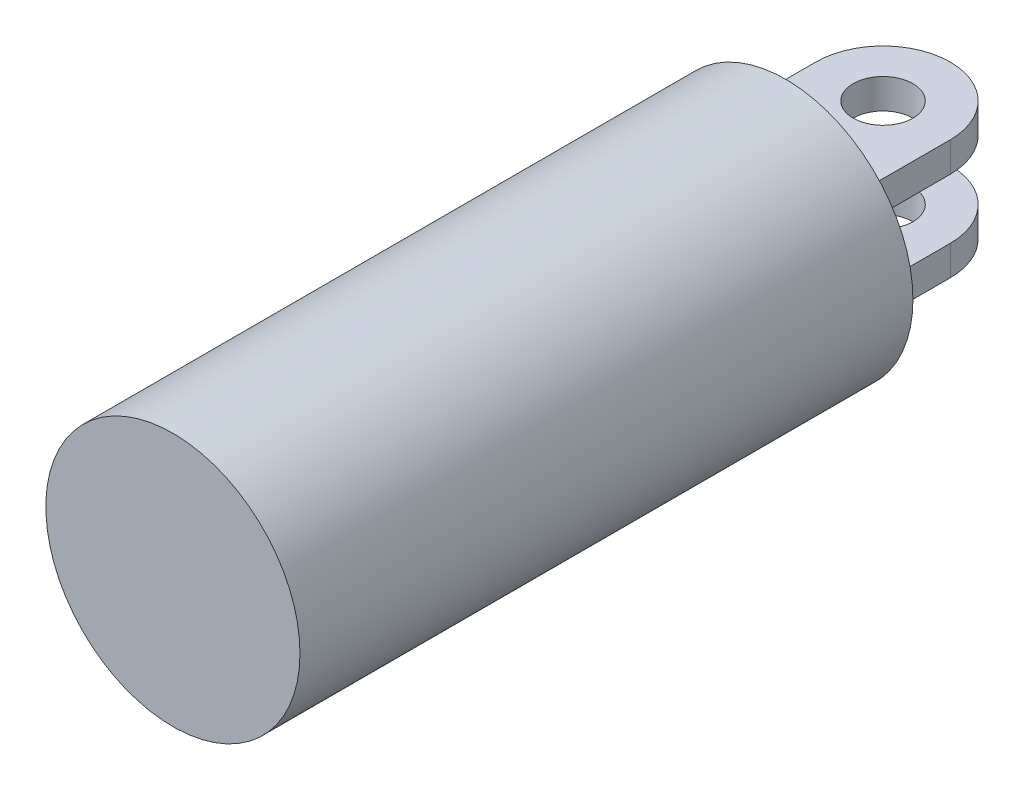
ISO-10303-21;
HEADER;
FILE_DESCRIPTION(('STEP AP214'),'2;1');
FILE_NAME('part.step','',(''),(''),'','','');
FILE_SCHEMA(('AUTOMOTIVE_DESIGN { 1 0 10303 214 1 1 1 1 }'));
ENDSEC;
DATA;
#1=APPLICATION_CONTEXT('core data for automotive mechanical design processes');
#2=APPLICATION_PROTOCOL_DEFINITION('international standard','automotive_design',2000,#1);
#3=PRODUCT_CONTEXT('',#1,'mechanical');
#4=PRODUCT('Part','Part','',(#3));
#5=PRODUCT_RELATED_PRODUCT_CATEGORY('part','',(#4));
#6=PRODUCT_DEFINITION_FORMATION('','',#4);
#7=PRODUCT_DEFINITION_CONTEXT('part definition',#1,'design');
#8=PRODUCT_DEFINITION('design','',#6,#7);
#9=PRODUCT_DEFINITION_SHAPE('','',#8);
#10=(LENGTH_UNIT() NAMED_UNIT(*) SI_UNIT(.MILLI.,.METRE.));
#11=(NAMED_UNIT(*) PLANE_ANGLE_UNIT() SI_UNIT($,.RADIAN.));
#12=(NAMED_UNIT(*) SI_UNIT($,.STERADIAN.) SOLID_ANGLE_UNIT());
#13=UNCERTAINTY_MEASURE_WITH_UNIT(LENGTH_MEASURE(1.E-05),#10,'distance_accuracy_value','');
#14=(GEOMETRIC_REPRESENTATION_CONTEXT(3) GLOBAL_UNCERTAINTY_ASSIGNED_CONTEXT((#13)) GLOBAL_UNIT_ASSIGNED_CONTEXT((#10,
#11,#12)) REPRESENTATION_CONTEXT('',''));
#15=CARTESIAN_POINT('',(0.,0.,0.));
#16=DIRECTION('',(0.,0.,1.));
#17=DIRECTION('',(1.,0.,0.));
#18=AXIS2_PLACEMENT_3D('',#15,#16,#17);
#19=CARTESIAN_POINT('',(28.575,-12.7,-69.85));
#20=DIRECTION('',(-1.,0.,0.));
#21=DIRECTION('',(0.,0.,1.));
#22=AXIS2_PLACEMENT_3D('',#19,#20,#21);
#23=PLANE('',#22);
#24=DIRECTION('',(0.,1.,0.));
#25=VECTOR('',#24,1.);
#26=CARTESIAN_POINT('',(28.575,-53.975,-41.275));
#27=LINE('',#26,#25);
#28=CARTESIAN_POINT('',(28.575,-25.4,-41.275));
#29=VERTEX_POINT('',#28);
#30=CARTESIAN_POINT('',(28.575,-12.7,-41.275));
#31=VERTEX_POINT('',#30);
#32=EDGE_CURVE('E112',#29,#31,#27,.T.);
#33=ORIENTED_EDGE('',*,*,#32,.T.);
#34=DIRECTION('',(0.,0.,1.));
#35=VECTOR('',#34,1.);
#36=CARTESIAN_POINT('',(28.575,-12.7,0.));
#37=LINE('',#36,#35);
#38=CARTESIAN_POINT('',(28.575,-12.7,0.));
#39=VERTEX_POINT('',#38);
#40=EDGE_CURVE('E158',#31,#39,#37,.T.);
#41=ORIENTED_EDGE('',*,*,#40,.T.);
#42=DIRECTION('',(0.,-1.,0.));
#43=VECTOR('',#42,1.);
#44=CARTESIAN_POINT('',(28.575,-12.7,0.));
#45=LINE('',#44,#43);
#46=CARTESIAN_POINT('',(28.575,-25.4,0.));
#47=VERTEX_POINT('',#46);
#48=EDGE_CURVE('E160',#39,#47,#45,.T.);
#49=ORIENTED_EDGE('',*,*,#48,.T.);
#50=DIRECTION('',(0.,0.,-1.));
#51=VECTOR('',#50,1.);
#52=CARTESIAN_POINT('',(28.575,-25.4,-69.85));
#53=LINE('',#52,#51);
#54=EDGE_CURVE('E162',#47,#29,#53,.T.);
#55=ORIENTED_EDGE('',*,*,#54,.T.);
#56=EDGE_LOOP('',(#33,#41,#49,#55));
#57=FACE_BOUND('',#56,.T.);
#58=ADVANCED_FACE('F33',(#57),#23,.F.);
#59=CARTESIAN_POINT('',(-28.575,-12.7,-69.85));
#60=DIRECTION('',(-1.,0.,0.));
#61=DIRECTION('',(0.,0.,1.));
#62=AXIS2_PLACEMENT_3D('',#59,#60,#61);
#63=PLANE('',#62);
#64=DIRECTION('',(0.,0.,1.));
#65=VECTOR('',#64,1.);
#66=CARTESIAN_POINT('',(-28.575,-12.7,0.));
#67=LINE('',#66,#65);
#68=CARTESIAN_POINT('',(-28.575,-12.7,-41.275));
#69=VERTEX_POINT('',#68);
#70=CARTESIAN_POINT('',(-28.575,-12.7,0.));
#71=VERTEX_POINT('',#70);
#72=EDGE_CURVE('E150',#69,#71,#67,.T.);
#73=ORIENTED_EDGE('',*,*,#72,.F.);
#74=DIRECTION('',(0.,1.,0.));
#75=VECTOR('',#74,1.);
#76=CARTESIAN_POINT('',(-28.575,-53.975,-41.275));
#77=LINE('',#76,#75);
#78=CARTESIAN_POINT('',(-28.575,-25.4,-41.275));
#79=VERTEX_POINT('',#78);
#80=EDGE_CURVE('E11',#69,#79,#77,.F.);
#81=ORIENTED_EDGE('',*,*,#80,.T.);
#82=DIRECTION('',(0.,0.,-1.));
#83=VECTOR('',#82,1.);
#84=CARTESIAN_POINT('',(-28.575,-25.4,-69.85));
#85=LINE('',#84,#83);
#86=CARTESIAN_POINT('',(-28.575,-25.4,0.));
#87=VERTEX_POINT('',#86);
#88=EDGE_CURVE('E155',#87,#79,#85,.T.);
#89=ORIENTED_EDGE('',*,*,#88,.F.);
#90=DIRECTION('',(0.,-1.,0.));
#91=VECTOR('',#90,1.);
#92=CARTESIAN_POINT('',(-28.575,-12.7,0.));
#93=LINE('',#92,#91);
#94=EDGE_CURVE('E152',#71,#87,#93,.T.);
#95=ORIENTED_EDGE('',*,*,#94,.F.);
#96=EDGE_LOOP('',(#73,#81,#89,#95));
#97=FACE_BOUND('',#96,.T.);
#98=ADVANCED_FACE('F197',(#97),#63,.T.);
#99=CARTESIAN_POINT('',(0.,0.,0.));
#100=DIRECTION('',(0.,0.,1.));
#101=DIRECTION('',(1.,0.,0.));
#102=AXIS2_PLACEMENT_3D('',#99,#100,#101);
#103=PLANE('',#102);
#104=CARTESIAN_POINT('',(0.,0.,0.));
#105=DIRECTION('',(0.,0.,1.));
#106=DIRECTION('',(1.,0.,0.));
#107=AXIS2_PLACEMENT_3D('',#104,#105,#106);
#108=CIRCLE('',#107,53.975);
#109=CARTESIAN_POINT('',(53.975,0.,0.));
#110=VERTEX_POINT('',#109);
#111=EDGE_CURVE('E127',#110,#110,#108,.T.);
#112=ORIENTED_EDGE('',*,*,#111,.F.);
#113=EDGE_LOOP('',(#112));
#114=FACE_BOUND('',#113,.T.);
#115=DIRECTION('',(-1.,0.,0.));
#116=VECTOR('',#115,1.);
#117=CARTESIAN_POINT('',(28.575,12.7,0.));
#118=LINE('',#117,#116);
#119=CARTESIAN_POINT('',(28.575,12.7,0.));
#120=VERTEX_POINT('',#119);
#121=CARTESIAN_POINT('',(-28.575,12.7,0.));
#122=VERTEX_POINT('',#121);
#123=EDGE_CURVE('E119',#120,#122,#118,.T.);
#124=ORIENTED_EDGE('',*,*,#123,.F.);
#125=DIRECTION('',(0.,-1.,0.));
#126=VECTOR('',#125,1.);
#127=CARTESIAN_POINT('',(28.575,25.4,0.));
#128=LINE('',#127,#126);
#129=CARTESIAN_POINT('',(28.575,25.4,0.));
#130=VERTEX_POINT('',#129);
#131=EDGE_CURVE('E121',#130,#120,#128,.T.);
#132=ORIENTED_EDGE('',*,*,#131,.F.);
#133=DIRECTION('',(-1.,0.,0.));
#134=VECTOR('',#133,1.);
#135=CARTESIAN_POINT('',(28.575,25.4,0.));
#136=LINE('',#135,#134);
#137=CARTESIAN_POINT('',(-28.575,25.4,0.));
#138=VERTEX_POINT('',#137);
#139=EDGE_CURVE('E117',#130,#138,#136,.T.);
#140=ORIENTED_EDGE('',*,*,#139,.T.);
#141=DIRECTION('',(0.,-1.,0.));
#142=VECTOR('',#141,1.);
#143=CARTESIAN_POINT('',(-28.575,25.4,0.));
#144=LINE('',#143,#142);
#145=EDGE_CURVE('E171',#138,#122,#144,.T.);
#146=ORIENTED_EDGE('',*,*,#145,.T.);
#147=EDGE_LOOP('',(#124,#132,#140,#146));
#148=FACE_BOUND('',#147,.T.);
#149=ORIENTED_EDGE('',*,*,#48,.F.);
#150=DIRECTION('',(-1.,0.,0.));
#151=VECTOR('',#150,1.);
#152=CARTESIAN_POINT('',(28.575,-12.7,0.));
#153=LINE('',#152,#151);
#154=EDGE_CURVE('E168',#39,#71,#153,.T.);
#155=ORIENTED_EDGE('',*,*,#154,.T.);
#156=ORIENTED_EDGE('',*,*,#94,.T.);
#157=DIRECTION('',(-1.,0.,0.));
#158=VECTOR('',#157,1.);
#159=CARTESIAN_POINT('',(28.575,-25.4,0.));
#160=LINE('',#159,#158);
#161=EDGE_CURVE('E165',#47,#87,#160,.T.);
#162=ORIENTED_EDGE('',*,*,#161,.F.);
#163=EDGE_LOOP('',(#149,#155,#156,#162));
#164=FACE_BOUND('',#163,.T.);
#165=ADVANCED_FACE('F178',(#114,#148,#164),#103,.F.);
#166=CARTESIAN_POINT('',(0.,0.,260.35));
#167=DIRECTION('',(0.,0.,-1.));
#168=DIRECTION('',(-1.,0.,0.));
#169=AXIS2_PLACEMENT_3D('',#166,#167,#168);
#170=CYLINDRICAL_SURFACE('',#169,53.975);
#171=CARTESIAN_POINT('',(0.,0.,260.35));
#172=DIRECTION('',(0.,0.,1.));
#173=DIRECTION('',(1.,0.,0.));
#174=AXIS2_PLACEMENT_3D('',#171,#172,#173);
#175=CIRCLE('',#174,53.975);
#176=CARTESIAN_POINT('',(53.975,0.,260.35));
#177=VERTEX_POINT('',#176);
#178=EDGE_CURVE('E41',#177,#177,#175,.T.);
#179=ORIENTED_EDGE('',*,*,#178,.F.);
#180=EDGE_LOOP('',(#179));
#181=FACE_BOUND('',#180,.T.);
#182=ORIENTED_EDGE('',*,*,#111,.T.);
#183=EDGE_LOOP('',(#182));
#184=FACE_BOUND('',#183,.T.);
#185=ADVANCED_FACE('F35',(#181,#184),#170,.T.);
#186=CARTESIAN_POINT('',(0.,0.,260.35));
#187=DIRECTION('',(0.,0.,1.));
#188=DIRECTION('',(1.,0.,0.));
#189=AXIS2_PLACEMENT_3D('',#186,#187,#188);
#190=PLANE('',#189);
#191=ORIENTED_EDGE('',*,*,#178,.T.);
#192=EDGE_LOOP('',(#191));
#193=FACE_BOUND('',#192,.T.);
#194=ADVANCED_FACE('F233',(#193),#190,.T.);
#195=CARTESIAN_POINT('',(28.575,12.7,-69.85));
#196=DIRECTION('',(0.,1.,0.));
#197=DIRECTION('',(0.,0.,1.));
#198=AXIS2_PLACEMENT_3D('',#195,#196,#197);
#199=PLANE('',#198);
#200=CARTESIAN_POINT('',(0.,12.7,-41.275));
#201=DIRECTION('',(0.,1.,0.));
#202=DIRECTION('',(0.,0.,1.));
#203=AXIS2_PLACEMENT_3D('',#200,#201,#202);
#204=CIRCLE('',#203,12.7);
#205=CARTESIAN_POINT('',(0.,12.7,-28.575));
#206=VERTEX_POINT('',#205);
#207=EDGE_CURVE('E138',#206,#206,#204,.T.);
#208=ORIENTED_EDGE('',*,*,#207,.T.);
#209=EDGE_LOOP('',(#208));
#210=FACE_BOUND('',#209,.T.);
#211=DIRECTION('',(0.,0.,-1.));
#212=VECTOR('',#211,1.);
#213=CARTESIAN_POINT('',(-28.575,12.7,-69.85));
#214=LINE('',#213,#212);
#215=CARTESIAN_POINT('',(-28.575,12.7,-41.275));
#216=VERTEX_POINT('',#215);
#217=EDGE_CURVE('E173',#122,#216,#214,.T.);
#218=ORIENTED_EDGE('',*,*,#217,.T.);
#219=CARTESIAN_POINT('',(0.,12.7,-41.275));
#220=DIRECTION('',(0.,1.,0.));
#221=DIRECTION('',(0.,0.,1.));
#222=AXIS2_PLACEMENT_3D('',#219,#220,#221);
#223=CIRCLE('',#222,28.575);
#224=CARTESIAN_POINT('',(28.575,12.6999999999999,-41.275));
#225=VERTEX_POINT('',#224);
#226=EDGE_CURVE('E48',#216,#225,#223,.F.);
#227=ORIENTED_EDGE('',*,*,#226,.T.);
#228=DIRECTION('',(0.,0.,-1.));
#229=VECTOR('',#228,1.);
#230=CARTESIAN_POINT('',(28.575,12.7,-69.85));
#231=LINE('',#230,#229);
#232=EDGE_CURVE('E111',#120,#225,#231,.T.);
#233=ORIENTED_EDGE('',*,*,#232,.F.);
#234=ORIENTED_EDGE('',*,*,#123,.T.);
#235=EDGE_LOOP('',(#218,#227,#233,#234));
#236=FACE_BOUND('',#235,.T.);
#237=ADVANCED_FACE('F183',(#210,#236),#199,.F.);
#238=CARTESIAN_POINT('',(28.575,25.4,0.));
#239=DIRECTION('',(0.,-1.,0.));
#240=DIRECTION('',(0.,0.,-1.));
#241=AXIS2_PLACEMENT_3D('',#238,#239,#240);
#242=PLANE('',#241);
#243=CARTESIAN_POINT('',(0.,25.4,-41.275));
#244=DIRECTION('',(0.,1.,0.));
#245=DIRECTION('',(0.,0.,1.));
#246=AXIS2_PLACEMENT_3D('',#243,#244,#245);
#247=CIRCLE('',#246,12.7);
#248=CARTESIAN_POINT('',(0.,25.4,-28.575));
#249=VERTEX_POINT('',#248);
#250=EDGE_CURVE('E134',#249,#249,#247,.T.);
#251=ORIENTED_EDGE('',*,*,#250,.F.);
#252=EDGE_LOOP('',(#251));
#253=FACE_BOUND('',#252,.T.);
#254=CARTESIAN_POINT('',(0.,25.4,-41.275));
#255=DIRECTION('',(0.,-1.,0.));
#256=DIRECTION('',(0.,0.,1.));
#257=AXIS2_PLACEMENT_3D('',#254,#255,#256);
#258=CIRCLE('',#257,28.575);
#259=CARTESIAN_POINT('',(-28.575,25.4,-41.275));
#260=VERTEX_POINT('',#259);
#261=CARTESIAN_POINT('',(28.575,25.4,-41.275));
#262=VERTEX_POINT('',#261);
#263=EDGE_CURVE('E95',#260,#262,#258,.T.);
#264=ORIENTED_EDGE('',*,*,#263,.F.);
#265=DIRECTION('',(0.,0.,1.));
#266=VECTOR('',#265,1.);
#267=CARTESIAN_POINT('',(-28.575,25.4,0.));
#268=LINE('',#267,#266);
#269=EDGE_CURVE('E176',#260,#138,#268,.T.);
#270=ORIENTED_EDGE('',*,*,#269,.T.);
#271=ORIENTED_EDGE('',*,*,#139,.F.);
#272=DIRECTION('',(0.,0.,1.));
#273=VECTOR('',#272,1.);
#274=CARTESIAN_POINT('',(28.575,25.4,0.));
#275=LINE('',#274,#273);
#276=EDGE_CURVE('E108',#262,#130,#275,.T.);
#277=ORIENTED_EDGE('',*,*,#276,.F.);
#278=EDGE_LOOP('',(#264,#270,#271,#277));
#279=FACE_BOUND('',#278,.T.);
#280=ADVANCED_FACE('F115',(#253,#279),#242,.F.);
#281=CARTESIAN_POINT('',(28.575,25.4,0.));
#282=DIRECTION('',(1.,0.,0.));
#283=DIRECTION('',(0.,0.,-1.));
#284=AXIS2_PLACEMENT_3D('',#281,#282,#283);
#285=PLANE('',#284);
#286=EDGE_CURVE('E98',#225,#262,#27,.T.);
#287=ORIENTED_EDGE('',*,*,#286,.T.);
#288=ORIENTED_EDGE('',*,*,#276,.T.);
#289=ORIENTED_EDGE('',*,*,#131,.T.);
#290=ORIENTED_EDGE('',*,*,#232,.T.);
#291=EDGE_LOOP('',(#287,#288,#289,#290));
#292=FACE_BOUND('',#291,.T.);
#293=ADVANCED_FACE('F106',(#292),#285,.T.);
#294=CARTESIAN_POINT('',(-28.575,25.4,0.));
#295=DIRECTION('',(1.,0.,0.));
#296=DIRECTION('',(0.,0.,-1.));
#297=AXIS2_PLACEMENT_3D('',#294,#295,#296);
#298=PLANE('',#297);
#299=ORIENTED_EDGE('',*,*,#269,.F.);
#300=DIRECTION('',(0.,1.,0.));
#301=VECTOR('',#300,1.);
#302=CARTESIAN_POINT('',(-28.575,-53.975,-41.275));
#303=LINE('',#302,#301);
#304=EDGE_CURVE('E100',#216,#260,#303,.T.);
#305=ORIENTED_EDGE('',*,*,#304,.F.);
#306=ORIENTED_EDGE('',*,*,#217,.F.);
#307=ORIENTED_EDGE('',*,*,#145,.F.);
#308=EDGE_LOOP('',(#299,#305,#306,#307));
#309=FACE_BOUND('',#308,.T.);
#310=ADVANCED_FACE('F185',(#309),#298,.F.);
#311=CARTESIAN_POINT('',(28.575,-12.7,0.));
#312=DIRECTION('',(0.,-1.,0.));
#313=DIRECTION('',(0.,0.,-1.));
#314=AXIS2_PLACEMENT_3D('',#311,#312,#313);
#315=PLANE('',#314);
#316=CARTESIAN_POINT('',(0.,-12.7,-41.275));
#317=DIRECTION('',(0.,-1.,0.));
#318=DIRECTION('',(0.,0.,-1.));
#319=AXIS2_PLACEMENT_3D('',#316,#317,#318);
#320=CIRCLE('',#319,12.7);
#321=CARTESIAN_POINT('',(0.,-12.7,-28.575));
#322=VERTEX_POINT('',#321);
#323=EDGE_CURVE('E133',#322,#322,#320,.T.);
#324=ORIENTED_EDGE('',*,*,#323,.T.);
#325=EDGE_LOOP('',(#324));
#326=FACE_BOUND('',#325,.T.);
#327=ORIENTED_EDGE('',*,*,#40,.F.);
#328=CARTESIAN_POINT('',(0.,-12.7,-41.275));
#329=DIRECTION('',(0.,-1.,0.));
#330=DIRECTION('',(0.,0.,-1.));
#331=AXIS2_PLACEMENT_3D('',#328,#329,#330);
#332=CIRCLE('',#331,28.575);
#333=EDGE_CURVE('E144',#31,#69,#332,.F.);
#334=ORIENTED_EDGE('',*,*,#333,.T.);
#335=ORIENTED_EDGE('',*,*,#72,.T.);
#336=ORIENTED_EDGE('',*,*,#154,.F.);
#337=EDGE_LOOP('',(#327,#334,#335,#336));
#338=FACE_BOUND('',#337,.T.);
#339=ADVANCED_FACE('F193',(#326,#338),#315,.F.);
#340=CARTESIAN_POINT('',(28.575,-25.4,-69.85));
#341=DIRECTION('',(0.,1.,0.));
#342=DIRECTION('',(0.,0.,1.));
#343=AXIS2_PLACEMENT_3D('',#340,#341,#342);
#344=PLANE('',#343);
#345=CARTESIAN_POINT('',(0.,-25.4,-41.275));
#346=DIRECTION('',(0.,1.,0.));
#347=DIRECTION('',(0.,0.,1.));
#348=AXIS2_PLACEMENT_3D('',#345,#346,#347);
#349=CIRCLE('',#348,12.7);
#350=CARTESIAN_POINT('',(0.,-25.4,-28.575));
#351=VERTEX_POINT('',#350);
#352=EDGE_CURVE('E131',#351,#351,#349,.T.);
#353=ORIENTED_EDGE('',*,*,#352,.T.);
#354=EDGE_LOOP('',(#353));
#355=FACE_BOUND('',#354,.T.);
#356=ORIENTED_EDGE('',*,*,#88,.T.);
#357=CARTESIAN_POINT('',(0.,-25.4,-41.275));
#358=DIRECTION('',(0.,1.,0.));
#359=DIRECTION('',(0.,0.,1.));
#360=AXIS2_PLACEMENT_3D('',#357,#358,#359);
#361=CIRCLE('',#360,28.575);
#362=EDGE_CURVE('E56',#79,#29,#361,.F.);
#363=ORIENTED_EDGE('',*,*,#362,.T.);
#364=ORIENTED_EDGE('',*,*,#54,.F.);
#365=ORIENTED_EDGE('',*,*,#161,.T.);
#366=EDGE_LOOP('',(#356,#363,#364,#365));
#367=FACE_BOUND('',#366,.T.);
#368=ADVANCED_FACE('F203',(#355,#367),#344,.F.);
#369=CARTESIAN_POINT('',(0.,-53.975,-41.275));
#370=DIRECTION('',(0.,1.,0.));
#371=DIRECTION('',(0.,0.,1.));
#372=AXIS2_PLACEMENT_3D('',#369,#370,#371);
#373=CYLINDRICAL_SURFACE('',#372,12.7);
#374=CARTESIAN_POINT('',(0.,-25.4,-28.575));
#375=CARTESIAN_POINT('',(0.,-25.2677083333333,-28.575));
#376=CARTESIAN_POINT('',(0.,-25.1354166666667,-28.575));
#377=CARTESIAN_POINT('',(0.,-24.8708333333333,-28.575));
#378=CARTESIAN_POINT('',(0.,-24.7385416666667,-28.575));
#379=CARTESIAN_POINT('',(0.,-24.4739583333333,-28.575));
#380=CARTESIAN_POINT('',(0.,-24.3416666666667,-28.575));
#381=CARTESIAN_POINT('',(0.,-24.0770833333333,-28.575));
#382=CARTESIAN_POINT('',(0.,-23.9447916666667,-28.575));
#383=CARTESIAN_POINT('',(0.,-23.6802083333333,-28.575));
#384=CARTESIAN_POINT('',(0.,-23.5479166666667,-28.575));
#385=CARTESIAN_POINT('',(0.,-23.2833333333333,-28.575));
#386=CARTESIAN_POINT('',(0.,-23.1510416666667,-28.575));
#387=CARTESIAN_POINT('',(0.,-22.8864583333333,-28.575));
#388=CARTESIAN_POINT('',(0.,-22.7541666666667,-28.575));
#389=CARTESIAN_POINT('',(0.,-22.4895833333333,-28.575));
#390=CARTESIAN_POINT('',(0.,-22.3572916666667,-28.575));
#391=CARTESIAN_POINT('',(0.,-22.0927083333333,-28.575));
#392=CARTESIAN_POINT('',(0.,-21.9604166666667,-28.575));
#393=CARTESIAN_POINT('',(0.,-21.6958333333333,-28.575));
#394=CARTESIAN_POINT('',(0.,-21.5635416666667,-28.575));
#395=CARTESIAN_POINT('',(0.,-21.2989583333333,-28.575));
#396=CARTESIAN_POINT('',(0.,-21.1666666666667,-28.575));
#397=CARTESIAN_POINT('',(0.,-20.9020833333333,-28.575));
#398=CARTESIAN_POINT('',(0.,-20.7697916666667,-28.575));
#399=CARTESIAN_POINT('',(0.,-20.5052083333333,-28.575));
#400=CARTESIAN_POINT('',(0.,-20.3729166666667,-28.575));
#401=CARTESIAN_POINT('',(0.,-20.1083333333333,-28.575));
#402=CARTESIAN_POINT('',(0.,-19.9760416666667,-28.575));
#403=CARTESIAN_POINT('',(0.,-19.7114583333333,-28.575));
#404=CARTESIAN_POINT('',(0.,-19.5791666666667,-28.575));
#405=CARTESIAN_POINT('',(0.,-19.3145833333333,-28.575));
#406=CARTESIAN_POINT('',(0.,-19.1822916666667,-28.575));
#407=CARTESIAN_POINT('',(0.,-18.9177083333333,-28.575));
#408=CARTESIAN_POINT('',(0.,-18.7854166666667,-28.575));
#409=CARTESIAN_POINT('',(0.,-18.5208333333333,-28.575));
#410=CARTESIAN_POINT('',(0.,-18.3885416666667,-28.575));
#411=CARTESIAN_POINT('',(0.,-18.1239583333333,-28.575));
#412=CARTESIAN_POINT('',(0.,-17.9916666666667,-28.575));
#413=CARTESIAN_POINT('',(0.,-17.7270833333333,-28.575));
#414=CARTESIAN_POINT('',(0.,-17.5947916666667,-28.575));
#415=CARTESIAN_POINT('',(0.,-17.3302083333333,-28.575));
#416=CARTESIAN_POINT('',(0.,-17.1979166666667,-28.575));
#417=CARTESIAN_POINT('',(0.,-16.9333333333333,-28.575));
#418=CARTESIAN_POINT('',(0.,-16.8010416666667,-28.575));
#419=CARTESIAN_POINT('',(0.,-16.5364583333333,-28.575));
#420=CARTESIAN_POINT('',(0.,-16.4041666666667,-28.575));
#421=CARTESIAN_POINT('',(0.,-16.1395833333333,-28.575));
#422=CARTESIAN_POINT('',(0.,-16.0072916666667,-28.575));
#423=CARTESIAN_POINT('',(0.,-15.7427083333333,-28.575));
#424=CARTESIAN_POINT('',(0.,-15.6104166666667,-28.575));
#425=CARTESIAN_POINT('',(0.,-15.3458333333333,-28.575));
#426=CARTESIAN_POINT('',(0.,-15.2135416666667,-28.575));
#427=CARTESIAN_POINT('',(0.,-14.9489583333333,-28.575));
#428=CARTESIAN_POINT('',(0.,-14.8166666666667,-28.575));
#429=CARTESIAN_POINT('',(0.,-14.5520833333333,-28.575));
#430=CARTESIAN_POINT('',(0.,-14.4197916666667,-28.575));
#431=CARTESIAN_POINT('',(0.,-14.1552083333333,-28.575));
#432=CARTESIAN_POINT('',(0.,-14.0229166666667,-28.575));
#433=CARTESIAN_POINT('',(0.,-13.7583333333333,-28.575));
#434=CARTESIAN_POINT('',(0.,-13.6260416666667,-28.575));
#435=CARTESIAN_POINT('',(0.,-13.3614583333333,-28.575));
#436=CARTESIAN_POINT('',(0.,-13.2291666666667,-28.575));
#437=CARTESIAN_POINT('',(0.,-12.9645833333333,-28.575));
#438=CARTESIAN_POINT('',(0.,-12.8322916666667,-28.575));
#439=CARTESIAN_POINT('',(0.,-12.7,-28.575));
#440=B_SPLINE_CURVE_WITH_KNOTS('',3,(#374,#375,#376,#377,#378,#379,#380,#381,#382,#383,#384,
#385,#386,#387,#388,#389,#390,#391,#392,#393,#394,#395,#396,#397,#398,#399,#400,#401,#402,#403,
#404,#405,#406,#407,#408,#409,#410,#411,#412,#413,#414,#415,#416,#417,#418,#419,#420,#421,#422,
#423,#424,#425,#426,#427,#428,#429,#430,#431,#432,#433,#434,#435,#436,#437,#438,#439),
.UNSPECIFIED.,.F.,.F.,(4,2,2,2,2,2,2,2,2,2,2,2,2,2,2,2,2,2,2,2,2,2,2,2,2,2,2,2,2,2,2,2,4),(0.,
0.396875000000001,0.793749999999999,1.190625,1.5875,1.984375,2.38125,2.778125,3.17499999999999,
3.571875,3.96875,4.36562499999999,4.7625,5.159375,5.55625,5.953125,6.35,6.746875,7.14375,
7.540625,7.9375,8.334375,8.73125,9.128125,9.525,9.921875,10.31875,10.715625,11.1125,11.509375,
11.90625,12.303125,12.7),.UNSPECIFIED.);
#441=EDGE_CURVE('BSEAM211',#351,#322,#440,.T.);
#442=ORIENTED_EDGE('',*,*,#352,.F.);
#443=ORIENTED_EDGE('',*,*,#323,.F.);
#444=ORIENTED_EDGE('',*,*,#441,.T.);
#445=ORIENTED_EDGE('',*,*,#441,.F.);
#446=EDGE_LOOP('',(#442,#444,#443,#445));
#447=FACE_BOUND('',#446,.T.);
#448=ADVANCED_FACE('F211',(#447),#373,.F.);
#449=CARTESIAN_POINT('',(0.,25.4,-28.575));
#450=CARTESIAN_POINT('',(0.,25.2677083333333,-28.575));
#451=CARTESIAN_POINT('',(0.,25.1354166666667,-28.575));
#452=CARTESIAN_POINT('',(0.,24.8708333333334,-28.575));
#453=CARTESIAN_POINT('',(0.,24.7385416666667,-28.575));
#454=CARTESIAN_POINT('',(0.,24.4739583333334,-28.575));
#455=CARTESIAN_POINT('',(0.,24.3416666666667,-28.575));
#456=CARTESIAN_POINT('',(0.,24.0770833333333,-28.575));
#457=CARTESIAN_POINT('',(0.,23.9447916666667,-28.575));
#458=CARTESIAN_POINT('',(0.,23.6802083333334,-28.575));
#459=CARTESIAN_POINT('',(0.,23.5479166666667,-28.575));
#460=CARTESIAN_POINT('',(0.,23.2833333333334,-28.575));
#461=CARTESIAN_POINT('',(0.,23.1510416666667,-28.575));
#462=CARTESIAN_POINT('',(0.,22.8864583333333,-28.575));
#463=CARTESIAN_POINT('',(0.,22.7541666666667,-28.575));
#464=CARTESIAN_POINT('',(0.,22.4895833333333,-28.575));
#465=CARTESIAN_POINT('',(0.,22.3572916666667,-28.575));
#466=CARTESIAN_POINT('',(0.,22.0927083333333,-28.575));
#467=CARTESIAN_POINT('',(0.,21.9604166666667,-28.575));
#468=CARTESIAN_POINT('',(0.,21.6958333333333,-28.575));
#469=CARTESIAN_POINT('',(0.,21.5635416666667,-28.575));
#470=CARTESIAN_POINT('',(0.,21.2989583333333,-28.575));
#471=CARTESIAN_POINT('',(0.,21.1666666666667,-28.575));
#472=CARTESIAN_POINT('',(0.,20.9020833333333,-28.575));
#473=CARTESIAN_POINT('',(0.,20.7697916666667,-28.575));
#474=CARTESIAN_POINT('',(0.,20.5052083333333,-28.575));
#475=CARTESIAN_POINT('',(0.,20.3729166666667,-28.575));
#476=CARTESIAN_POINT('',(0.,20.1083333333333,-28.575));
#477=CARTESIAN_POINT('',(0.,19.9760416666667,-28.575));
#478=CARTESIAN_POINT('',(0.,19.7114583333333,-28.575));
#479=CARTESIAN_POINT('',(0.,19.5791666666667,-28.575));
#480=CARTESIAN_POINT('',(0.,19.3145833333333,-28.575));
#481=CARTESIAN_POINT('',(0.,19.1822916666667,-28.575));
#482=CARTESIAN_POINT('',(0.,18.9177083333333,-28.575));
#483=CARTESIAN_POINT('',(0.,18.7854166666667,-28.575));
#484=CARTESIAN_POINT('',(0.,18.5208333333333,-28.575));
#485=CARTESIAN_POINT('',(0.,18.3885416666667,-28.575));
#486=CARTESIAN_POINT('',(0.,18.1239583333333,-28.575));
#487=CARTESIAN_POINT('',(0.,17.9916666666667,-28.575));
#488=CARTESIAN_POINT('',(0.,17.7270833333333,-28.575));
#489=CARTESIAN_POINT('',(0.,17.5947916666667,-28.575));
#490=CARTESIAN_POINT('',(0.,17.3302083333333,-28.575));
#491=CARTESIAN_POINT('',(0.,17.1979166666667,-28.575));
#492=CARTESIAN_POINT('',(0.,16.9333333333333,-28.575));
#493=CARTESIAN_POINT('',(0.,16.8010416666667,-28.575));
#494=CARTESIAN_POINT('',(0.,16.5364583333333,-28.575));
#495=CARTESIAN_POINT('',(0.,16.4041666666667,-28.575));
#496=CARTESIAN_POINT('',(0.,16.1395833333333,-28.575));
#497=CARTESIAN_POINT('',(0.,16.0072916666667,-28.575));
#498=CARTESIAN_POINT('',(0.,15.7427083333333,-28.575));
#499=CARTESIAN_POINT('',(0.,15.6104166666667,-28.575));
#500=CARTESIAN_POINT('',(0.,15.3458333333333,-28.575));
#501=CARTESIAN_POINT('',(0.,15.2135416666667,-28.575));
#502=CARTESIAN_POINT('',(0.,14.9489583333333,-28.575));
#503=CARTESIAN_POINT('',(0.,14.8166666666667,-28.575));
#504=CARTESIAN_POINT('',(0.,14.5520833333333,-28.575));
#505=CARTESIAN_POINT('',(0.,14.4197916666667,-28.575));
#506=CARTESIAN_POINT('',(0.,14.1552083333333,-28.575));
#507=CARTESIAN_POINT('',(0.,14.0229166666667,-28.575));
#508=CARTESIAN_POINT('',(0.,13.7583333333333,-28.575));
#509=CARTESIAN_POINT('',(0.,13.6260416666667,-28.575));
#510=CARTESIAN_POINT('',(0.,13.3614583333333,-28.575));
#511=CARTESIAN_POINT('',(0.,13.2291666666667,-28.575));
#512=CARTESIAN_POINT('',(0.,12.9645833333333,-28.575));
#513=CARTESIAN_POINT('',(0.,12.8322916666667,-28.575));
#514=CARTESIAN_POINT('',(0.,12.7,-28.575));
#515=B_SPLINE_CURVE_WITH_KNOTS('',3,(#449,#450,#451,#452,#453,#454,#455,#456,#457,#458,#459,
#460,#461,#462,#463,#464,#465,#466,#467,#468,#469,#470,#471,#472,#473,#474,#475,#476,#477,#478,
#479,#480,#481,#482,#483,#484,#485,#486,#487,#488,#489,#490,#491,#492,#493,#494,#495,#496,#497,
#498,#499,#500,#501,#502,#503,#504,#505,#506,#507,#508,#509,#510,#511,#512,#513,#514),
.UNSPECIFIED.,.F.,.F.,(4,2,2,2,2,2,2,2,2,2,2,2,2,2,2,2,2,2,2,2,2,2,2,2,2,2,2,2,2,2,2,2,4),(0.,
0.396875000000005,0.793749999999996,1.190625,1.58750000000001,1.984375,2.38125,2.77812500000001,
3.17500000000001,3.571875,3.96875000000001,4.36562500000001,4.7625,5.15937500000001,
5.55625000000001,5.953125,6.35000000000001,6.74687500000001,7.14375,7.54062500000001,
7.93750000000001,8.334375,8.73125000000001,9.12812500000001,9.52500000000001,9.92187500000001,
10.31875,10.715625,11.1125,11.509375,11.90625,12.303125,12.7),.UNSPECIFIED.);
#516=EDGE_CURVE('BSEAM206',#249,#206,#515,.T.);
#517=ORIENTED_EDGE('',*,*,#250,.T.);
#518=ORIENTED_EDGE('',*,*,#207,.F.);
#519=ORIENTED_EDGE('',*,*,#516,.T.);
#520=ORIENTED_EDGE('',*,*,#516,.F.);
#521=EDGE_LOOP('',(#517,#519,#518,#520));
#522=FACE_BOUND('',#521,.T.);
#523=ADVANCED_FACE('F206',(#522),#373,.F.);
#524=CARTESIAN_POINT('',(0.,-53.975,-41.275));
#525=DIRECTION('',(0.,1.,0.));
#526=DIRECTION('',(0.,0.,1.));
#527=AXIS2_PLACEMENT_3D('',#524,#525,#526);
#528=CYLINDRICAL_SURFACE('',#527,28.575);
#529=ORIENTED_EDGE('',*,*,#333,.F.);
#530=ORIENTED_EDGE('',*,*,#32,.F.);
#531=ORIENTED_EDGE('',*,*,#362,.F.);
#532=ORIENTED_EDGE('',*,*,#80,.F.);
#533=EDGE_LOOP('',(#529,#530,#531,#532));
#534=FACE_BOUND('',#533,.T.);
#535=ADVANCED_FACE('F204',(#534),#528,.T.);
#536=ORIENTED_EDGE('',*,*,#304,.T.);
#537=ORIENTED_EDGE('',*,*,#263,.T.);
#538=ORIENTED_EDGE('',*,*,#286,.F.);
#539=ORIENTED_EDGE('',*,*,#226,.F.);
#540=EDGE_LOOP('',(#536,#537,#538,#539));
#541=FACE_BOUND('',#540,.T.);
#542=ADVANCED_FACE('F97',(#541),#528,.T.);
#543=CLOSED_SHELL('',(#58,#98,#165,#185,#194,#237,#280,#293,#310,#339,#368,#448,#523,#535,#542));
#544=MANIFOLD_SOLID_BREP('B2',#543);
#545=ADVANCED_BREP_SHAPE_REPRESENTATION('',(#18,#544),#14);
#546=SHAPE_DEFINITION_REPRESENTATION(#9,#545);
ENDSEC;
END-ISO-10303-21;
